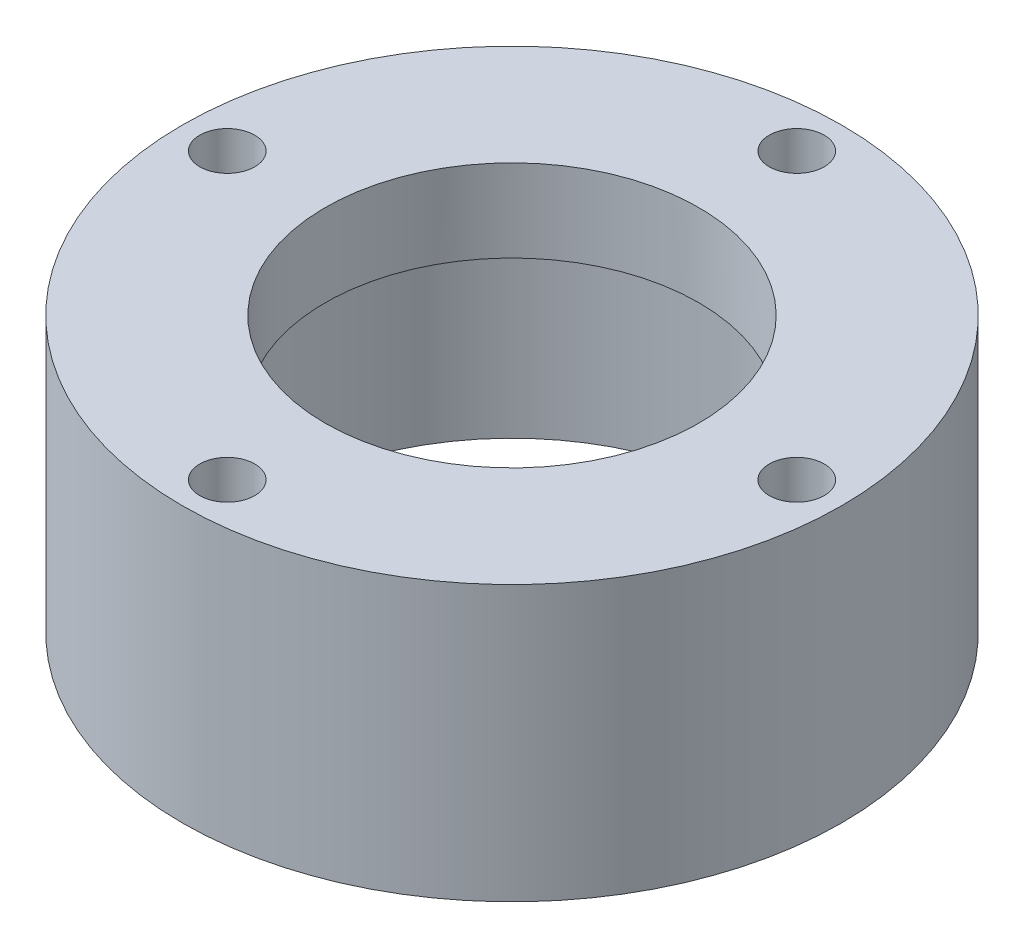
ISO-10303-21;
HEADER;
FILE_DESCRIPTION(('STEP AP214'),'2;1');
FILE_NAME('part.step','',(''),(''),'','','');
FILE_SCHEMA(('AUTOMOTIVE_DESIGN { 1 0 10303 214 1 1 1 1 }'));
ENDSEC;
DATA;
#1=APPLICATION_CONTEXT('core data for automotive mechanical design processes');
#2=APPLICATION_PROTOCOL_DEFINITION('international standard','automotive_design',2000,#1);
#3=PRODUCT_CONTEXT('',#1,'mechanical');
#4=PRODUCT('Part','Part','',(#3));
#5=PRODUCT_RELATED_PRODUCT_CATEGORY('part','',(#4));
#6=PRODUCT_DEFINITION_FORMATION('','',#4);
#7=PRODUCT_DEFINITION_CONTEXT('part definition',#1,'design');
#8=PRODUCT_DEFINITION('design','',#6,#7);
#9=PRODUCT_DEFINITION_SHAPE('','',#8);
#10=(LENGTH_UNIT() NAMED_UNIT(*) SI_UNIT(.MILLI.,.METRE.));
#11=(NAMED_UNIT(*) PLANE_ANGLE_UNIT() SI_UNIT($,.RADIAN.));
#12=(NAMED_UNIT(*) SI_UNIT($,.STERADIAN.) SOLID_ANGLE_UNIT());
#13=UNCERTAINTY_MEASURE_WITH_UNIT(LENGTH_MEASURE(1.E-05),#10,'distance_accuracy_value','');
#14=(GEOMETRIC_REPRESENTATION_CONTEXT(3) GLOBAL_UNCERTAINTY_ASSIGNED_CONTEXT((#13)) GLOBAL_UNIT_ASSIGNED_CONTEXT((#10,
#11,#12)) REPRESENTATION_CONTEXT('',''));
#15=CARTESIAN_POINT('',(0.,0.,0.));
#16=DIRECTION('',(0.,0.,1.));
#17=DIRECTION('',(1.,0.,0.));
#18=AXIS2_PLACEMENT_3D('',#15,#16,#17);
#19=CARTESIAN_POINT('',(0.,13.,1.75400207095439));
#20=DIRECTION('',(0.,-1.,0.));
#21=DIRECTION('',(0.,0.,-1.));
#22=AXIS2_PLACEMENT_3D('',#19,#20,#21);
#23=CYLINDRICAL_SURFACE('',#22,18.);
#24=CARTESIAN_POINT('',(0.,13.,1.75400207095439));
#25=DIRECTION('',(0.,1.,0.));
#26=DIRECTION('',(0.,0.,1.));
#27=AXIS2_PLACEMENT_3D('',#24,#25,#26);
#28=CIRCLE('',#27,18.);
#29=CARTESIAN_POINT('',(0.,13.,19.7540020709544));
#30=VERTEX_POINT('',#29);
#31=EDGE_CURVE('E10',#30,#30,#28,.T.);
#32=ORIENTED_EDGE('',*,*,#31,.F.);
#33=EDGE_LOOP('',(#32));
#34=FACE_BOUND('',#33,.T.);
#35=CARTESIAN_POINT('',(0.,-2.,1.75400207095439));
#36=DIRECTION('',(0.,1.,0.));
#37=DIRECTION('',(0.,0.,1.));
#38=AXIS2_PLACEMENT_3D('',#35,#36,#37);
#39=CIRCLE('',#38,18.);
#40=CARTESIAN_POINT('',(0.,-2.,19.7540020709544));
#41=VERTEX_POINT('',#40);
#42=EDGE_CURVE('E36',#41,#41,#39,.T.);
#43=ORIENTED_EDGE('',*,*,#42,.T.);
#44=EDGE_LOOP('',(#43));
#45=FACE_BOUND('',#44,.T.);
#46=ADVANCED_FACE('F29',(#34,#45),#23,.T.);
#47=CARTESIAN_POINT('',(0.,13.,1.75400207095439));
#48=DIRECTION('',(0.,1.,0.));
#49=DIRECTION('',(0.,0.,1.));
#50=AXIS2_PLACEMENT_3D('',#47,#48,#49);
#51=PLANE('',#50);
#52=CARTESIAN_POINT('',(-15.5458589026705,13.,1.75400207095438));
#53=DIRECTION('',(0.,1.,0.));
#54=DIRECTION('',(0.,0.,1.));
#55=AXIS2_PLACEMENT_3D('',#52,#53,#54);
#56=CIRCLE('',#55,1.5);
#57=CARTESIAN_POINT('',(-15.5458589026705,13.,3.25400207095439));
#58=VERTEX_POINT('',#57);
#59=EDGE_CURVE('E70',#58,#58,#56,.T.);
#60=ORIENTED_EDGE('',*,*,#59,.F.);
#61=EDGE_LOOP('',(#60));
#62=FACE_BOUND('',#61,.T.);
#63=CARTESIAN_POINT('',(0.,13.,17.2998609736249));
#64=DIRECTION('',(0.,1.,0.));
#65=DIRECTION('',(0.,0.,1.));
#66=AXIS2_PLACEMENT_3D('',#63,#64,#65);
#67=CIRCLE('',#66,1.5);
#68=CARTESIAN_POINT('',(0.,13.,18.7998609736249));
#69=VERTEX_POINT('',#68);
#70=EDGE_CURVE('E64',#69,#69,#67,.T.);
#71=ORIENTED_EDGE('',*,*,#70,.F.);
#72=EDGE_LOOP('',(#71));
#73=FACE_BOUND('',#72,.T.);
#74=CARTESIAN_POINT('',(15.5458589026705,13.,1.75400207095438));
#75=DIRECTION('',(0.,1.,0.));
#76=DIRECTION('',(0.,0.,1.));
#77=AXIS2_PLACEMENT_3D('',#74,#75,#76);
#78=CIRCLE('',#77,1.5);
#79=CARTESIAN_POINT('',(15.5458589026705,13.,3.25400207095439));
#80=VERTEX_POINT('',#79);
#81=EDGE_CURVE('E58',#80,#80,#78,.T.);
#82=ORIENTED_EDGE('',*,*,#81,.F.);
#83=EDGE_LOOP('',(#82));
#84=FACE_BOUND('',#83,.T.);
#85=CARTESIAN_POINT('',(0.,13.,-13.7918568317161));
#86=DIRECTION('',(0.,1.,0.));
#87=DIRECTION('',(0.,0.,1.));
#88=AXIS2_PLACEMENT_3D('',#85,#86,#87);
#89=CIRCLE('',#88,1.5);
#90=CARTESIAN_POINT('',(0.,13.,-12.2918568317161));
#91=VERTEX_POINT('',#90);
#92=EDGE_CURVE('E52',#91,#91,#89,.T.);
#93=ORIENTED_EDGE('',*,*,#92,.F.);
#94=EDGE_LOOP('',(#93));
#95=FACE_BOUND('',#94,.T.);
#96=CARTESIAN_POINT('',(3.80921266751599E-08,13.,1.75400198054687));
#97=DIRECTION('',(0.,1.,0.));
#98=DIRECTION('',(0.,0.,1.));
#99=AXIS2_PLACEMENT_3D('',#96,#97,#98);
#100=CIRCLE('',#99,10.2000000049055);
#101=CARTESIAN_POINT('',(3.80921266751599E-08,13.,11.9540019854523));
#102=VERTEX_POINT('',#101);
#103=EDGE_CURVE('E48',#102,#102,#100,.T.);
#104=ORIENTED_EDGE('',*,*,#103,.F.);
#105=EDGE_LOOP('',(#104));
#106=FACE_BOUND('',#105,.T.);
#107=ORIENTED_EDGE('',*,*,#31,.T.);
#108=EDGE_LOOP('',(#107));
#109=FACE_BOUND('',#108,.T.);
#110=ADVANCED_FACE('F86',(#62,#73,#84,#95,#106,#109),#51,.T.);
#111=CARTESIAN_POINT('',(0.,-2.,1.75400207095439));
#112=DIRECTION('',(0.,1.,0.));
#113=DIRECTION('',(0.,0.,1.));
#114=AXIS2_PLACEMENT_3D('',#111,#112,#113);
#115=PLANE('',#114);
#116=CARTESIAN_POINT('',(-15.5458589026705,-2.,1.75400207095438));
#117=DIRECTION('',(0.,1.,0.));
#118=DIRECTION('',(0.,0.,1.));
#119=AXIS2_PLACEMENT_3D('',#116,#117,#118);
#120=CIRCLE('',#119,1.5);
#121=CARTESIAN_POINT('',(-15.5458589026705,-2.,3.25400207095439));
#122=VERTEX_POINT('',#121);
#123=EDGE_CURVE('E67',#122,#122,#120,.T.);
#124=ORIENTED_EDGE('',*,*,#123,.T.);
#125=EDGE_LOOP('',(#124));
#126=FACE_BOUND('',#125,.T.);
#127=CARTESIAN_POINT('',(0.,-2.,17.2998609736249));
#128=DIRECTION('',(0.,1.,0.));
#129=DIRECTION('',(0.,0.,1.));
#130=AXIS2_PLACEMENT_3D('',#127,#128,#129);
#131=CIRCLE('',#130,1.5);
#132=CARTESIAN_POINT('',(0.,-2.,18.7998609736249));
#133=VERTEX_POINT('',#132);
#134=EDGE_CURVE('E61',#133,#133,#131,.T.);
#135=ORIENTED_EDGE('',*,*,#134,.T.);
#136=EDGE_LOOP('',(#135));
#137=FACE_BOUND('',#136,.T.);
#138=CARTESIAN_POINT('',(15.5458589026705,-2.,1.75400207095438));
#139=DIRECTION('',(0.,1.,0.));
#140=DIRECTION('',(0.,0.,1.));
#141=AXIS2_PLACEMENT_3D('',#138,#139,#140);
#142=CIRCLE('',#141,1.5);
#143=CARTESIAN_POINT('',(15.5458589026705,-2.,3.25400207095439));
#144=VERTEX_POINT('',#143);
#145=EDGE_CURVE('E55',#144,#144,#142,.T.);
#146=ORIENTED_EDGE('',*,*,#145,.T.);
#147=EDGE_LOOP('',(#146));
#148=FACE_BOUND('',#147,.T.);
#149=CARTESIAN_POINT('',(0.,-2.,-13.7918568317161));
#150=DIRECTION('',(0.,1.,0.));
#151=DIRECTION('',(0.,0.,1.));
#152=AXIS2_PLACEMENT_3D('',#149,#150,#151);
#153=CIRCLE('',#152,1.5);
#154=CARTESIAN_POINT('',(0.,-2.,-12.2918568317161));
#155=VERTEX_POINT('',#154);
#156=EDGE_CURVE('E51',#155,#155,#153,.T.);
#157=ORIENTED_EDGE('',*,*,#156,.T.);
#158=EDGE_LOOP('',(#157));
#159=FACE_BOUND('',#158,.T.);
#160=CARTESIAN_POINT('',(3.80744880068562E-08,-2.,1.75400198057407));
#161=DIRECTION('',(0.,-1.,0.));
#162=DIRECTION('',(0.,0.,-1.));
#163=AXIS2_PLACEMENT_3D('',#160,#161,#162);
#164=CIRCLE('',#163,13.0000000009261);
#165=CARTESIAN_POINT('',(3.80744880068562E-08,-2.,-11.245998020352));
#166=VERTEX_POINT('',#165);
#167=EDGE_CURVE('E43',#166,#166,#164,.T.);
#168=ORIENTED_EDGE('',*,*,#167,.F.);
#169=EDGE_LOOP('',(#168));
#170=FACE_BOUND('',#169,.T.);
#171=ORIENTED_EDGE('',*,*,#42,.F.);
#172=EDGE_LOOP('',(#171));
#173=FACE_BOUND('',#172,.T.);
#174=ADVANCED_FACE('F76',(#126,#137,#148,#159,#170,#173),#115,.F.);
#175=CARTESIAN_POINT('',(3.80744880068562E-08,8.5,1.75400198057407));
#176=DIRECTION('',(0.,-1.,0.));
#177=DIRECTION('',(0.,0.,-1.));
#178=AXIS2_PLACEMENT_3D('',#175,#176,#177);
#179=CYLINDRICAL_SURFACE('',#178,13.0000000009261);
#180=CARTESIAN_POINT('',(3.80744880068562E-08,8.5,1.75400198057407));
#181=DIRECTION('',(0.,-1.,0.));
#182=DIRECTION('',(0.,0.,-1.));
#183=AXIS2_PLACEMENT_3D('',#180,#181,#182);
#184=CIRCLE('',#183,13.0000000009261);
#185=CARTESIAN_POINT('',(3.80744880068562E-08,8.5,-11.245998020352));
#186=VERTEX_POINT('',#185);
#187=EDGE_CURVE('E41',#186,#186,#184,.T.);
#188=CARTESIAN_POINT('',(3.80744880068562E-08,8.5,-11.245998020352));
#189=CARTESIAN_POINT('',(3.80744880068562E-08,8.390625,-11.245998020352));
#190=CARTESIAN_POINT('',(3.80744880068562E-08,8.28125,-11.245998020352));
#191=CARTESIAN_POINT('',(3.80744880068562E-08,8.0625,-11.245998020352));
#192=CARTESIAN_POINT('',(3.80744880068562E-08,7.953125,-11.245998020352));
#193=CARTESIAN_POINT('',(3.80744880068562E-08,7.734375,-11.245998020352));
#194=CARTESIAN_POINT('',(3.80744880068562E-08,7.625,-11.245998020352));
#195=CARTESIAN_POINT('',(3.80744880068562E-08,7.40625,-11.245998020352));
#196=CARTESIAN_POINT('',(3.80744880068562E-08,7.296875,-11.245998020352));
#197=CARTESIAN_POINT('',(3.80744880068562E-08,7.078125,-11.245998020352));
#198=CARTESIAN_POINT('',(3.80744880068562E-08,6.96875,-11.245998020352));
#199=CARTESIAN_POINT('',(3.80744880068562E-08,6.75,-11.245998020352));
#200=CARTESIAN_POINT('',(3.80744880068562E-08,6.640625,-11.245998020352));
#201=CARTESIAN_POINT('',(3.80744880068562E-08,6.421875,-11.245998020352));
#202=CARTESIAN_POINT('',(3.80744880068562E-08,6.3125,-11.245998020352));
#203=CARTESIAN_POINT('',(3.80744880068562E-08,6.09375,-11.245998020352));
#204=CARTESIAN_POINT('',(3.80744880068562E-08,5.984375,-11.245998020352));
#205=CARTESIAN_POINT('',(3.80744880068562E-08,5.765625,-11.245998020352));
#206=CARTESIAN_POINT('',(3.80744880068562E-08,5.65625,-11.245998020352));
#207=CARTESIAN_POINT('',(3.80744880068562E-08,5.4375,-11.245998020352));
#208=CARTESIAN_POINT('',(3.80744880068562E-08,5.328125,-11.245998020352));
#209=CARTESIAN_POINT('',(3.80744880068562E-08,5.109375,-11.245998020352));
#210=CARTESIAN_POINT('',(3.80744880068562E-08,5.,-11.245998020352));
#211=CARTESIAN_POINT('',(3.80744880068562E-08,4.78125,-11.245998020352));
#212=CARTESIAN_POINT('',(3.80744880068562E-08,4.671875,-11.245998020352));
#213=CARTESIAN_POINT('',(3.80744880068562E-08,4.453125,-11.245998020352));
#214=CARTESIAN_POINT('',(3.80744880068562E-08,4.34375,-11.245998020352));
#215=CARTESIAN_POINT('',(3.80744880068562E-08,4.125,-11.245998020352));
#216=CARTESIAN_POINT('',(3.80744880068562E-08,4.015625,-11.245998020352));
#217=CARTESIAN_POINT('',(3.80744880068562E-08,3.796875,-11.245998020352));
#218=CARTESIAN_POINT('',(3.80744880068562E-08,3.6875,-11.245998020352));
#219=CARTESIAN_POINT('',(3.80744880068562E-08,3.46875,-11.245998020352));
#220=CARTESIAN_POINT('',(3.80744880068562E-08,3.359375,-11.245998020352));
#221=CARTESIAN_POINT('',(3.80744880068562E-08,3.140625,-11.245998020352));
#222=CARTESIAN_POINT('',(3.80744880068562E-08,3.03125,-11.245998020352));
#223=CARTESIAN_POINT('',(3.80744880068562E-08,2.8125,-11.245998020352));
#224=CARTESIAN_POINT('',(3.80744880068562E-08,2.703125,-11.245998020352));
#225=CARTESIAN_POINT('',(3.80744880068562E-08,2.484375,-11.245998020352));
#226=CARTESIAN_POINT('',(3.80744880068562E-08,2.375,-11.245998020352));
#227=CARTESIAN_POINT('',(3.80744880068562E-08,2.15625,-11.245998020352));
#228=CARTESIAN_POINT('',(3.80744880068562E-08,2.046875,-11.245998020352));
#229=CARTESIAN_POINT('',(3.80744880068562E-08,1.828125,-11.245998020352));
#230=CARTESIAN_POINT('',(3.80744880068562E-08,1.71875,-11.245998020352));
#231=CARTESIAN_POINT('',(3.80744880068562E-08,1.5,-11.245998020352));
#232=CARTESIAN_POINT('',(3.80744880068562E-08,1.390625,-11.245998020352));
#233=CARTESIAN_POINT('',(3.80744880068562E-08,1.171875,-11.245998020352));
#234=CARTESIAN_POINT('',(3.80744880068562E-08,1.0625,-11.245998020352));
#235=CARTESIAN_POINT('',(3.80744880068562E-08,0.84375,-11.245998020352));
#236=CARTESIAN_POINT('',(3.80744880068562E-08,0.734375,-11.245998020352));
#237=CARTESIAN_POINT('',(3.80744880068562E-08,0.515625,-11.245998020352));
#238=CARTESIAN_POINT('',(3.80744880068562E-08,0.40625,-11.245998020352));
#239=CARTESIAN_POINT('',(3.80744880068562E-08,0.1875,-11.245998020352));
#240=CARTESIAN_POINT('',(3.80744880068562E-08,0.0781250000000001,-11.245998020352));
#241=CARTESIAN_POINT('',(3.80744880068562E-08,-0.140625,-11.245998020352));
#242=CARTESIAN_POINT('',(3.80744880068562E-08,-0.249999999999999,-11.245998020352));
#243=CARTESIAN_POINT('',(3.80744880068562E-08,-0.468749999999999,-11.245998020352));
#244=CARTESIAN_POINT('',(3.80744880068562E-08,-0.578124999999999,-11.245998020352));
#245=CARTESIAN_POINT('',(3.80744880068562E-08,-0.796874999999999,-11.245998020352));
#246=CARTESIAN_POINT('',(3.80744880068562E-08,-0.906249999999999,-11.245998020352));
#247=CARTESIAN_POINT('',(3.80744880068562E-08,-1.125,-11.245998020352));
#248=CARTESIAN_POINT('',(3.80744880068562E-08,-1.234375,-11.245998020352));
#249=CARTESIAN_POINT('',(3.80744880068562E-08,-1.453125,-11.245998020352));
#250=CARTESIAN_POINT('',(3.80744880068562E-08,-1.5625,-11.245998020352));
#251=CARTESIAN_POINT('',(3.80744880068562E-08,-1.78125,-11.245998020352));
#252=CARTESIAN_POINT('',(3.80744880068562E-08,-1.890625,-11.245998020352));
#253=CARTESIAN_POINT('',(3.80744880068562E-08,-2.,-11.245998020352));
#254=B_SPLINE_CURVE_WITH_KNOTS('',3,(#188,#189,#190,#191,#192,#193,#194,#195,#196,#197,#198,
#199,#200,#201,#202,#203,#204,#205,#206,#207,#208,#209,#210,#211,#212,#213,#214,#215,#216,#217,
#218,#219,#220,#221,#222,#223,#224,#225,#226,#227,#228,#229,#230,#231,#232,#233,#234,#235,#236,
#237,#238,#239,#240,#241,#242,#243,#244,#245,#246,#247,#248,#249,#250,#251,#252,#253),
.UNSPECIFIED.,.F.,.F.,(4,2,2,2,2,2,2,2,2,2,2,2,2,2,2,2,2,2,2,2,2,2,2,2,2,2,2,2,2,2,2,2,4),(0.,
0.328125,0.656250000000001,0.984375000000001,1.3125,1.640625,1.96875,2.296875,2.625,2.953125,
3.28125,3.609375,3.9375,4.265625,4.59375,4.921875,5.25,5.578125,5.90625,6.234375,6.5625,
6.890625,7.21875,7.546875,7.875,8.203125,8.53125,8.859375,9.1875,9.515625,9.84375,10.171875,
10.5),.UNSPECIFIED.);
#255=EDGE_CURVE('BSEAM111',#186,#166,#254,.T.);
#256=ORIENTED_EDGE('',*,*,#187,.F.);
#257=ORIENTED_EDGE('',*,*,#167,.T.);
#258=ORIENTED_EDGE('',*,*,#255,.T.);
#259=ORIENTED_EDGE('',*,*,#255,.F.);
#260=EDGE_LOOP('',(#256,#258,#257,#259));
#261=FACE_BOUND('',#260,.T.);
#262=ADVANCED_FACE('F111',(#261),#179,.F.);
#263=CARTESIAN_POINT('',(3.80744880068562E-08,8.5,1.75400198057407));
#264=DIRECTION('',(0.,-1.,0.));
#265=DIRECTION('',(0.,0.,-1.));
#266=AXIS2_PLACEMENT_3D('',#263,#264,#265);
#267=PLANE('',#266);
#268=CARTESIAN_POINT('',(3.80921266751599E-08,8.5,1.75400198054687));
#269=DIRECTION('',(0.,-1.,0.));
#270=DIRECTION('',(0.,0.,-1.));
#271=AXIS2_PLACEMENT_3D('',#268,#269,#270);
#272=CIRCLE('',#271,10.2000000049055);
#273=CARTESIAN_POINT('',(3.80921266751599E-08,8.5,-8.44599802435859));
#274=VERTEX_POINT('',#273);
#275=EDGE_CURVE('E32',#274,#274,#272,.T.);
#276=ORIENTED_EDGE('',*,*,#275,.F.);
#277=EDGE_LOOP('',(#276));
#278=FACE_BOUND('',#277,.T.);
#279=ORIENTED_EDGE('',*,*,#187,.T.);
#280=EDGE_LOOP('',(#279));
#281=FACE_BOUND('',#280,.T.);
#282=ADVANCED_FACE('F101',(#278,#281),#267,.T.);
#283=CARTESIAN_POINT('',(3.80921266751599E-08,-2.,1.75400198054687));
#284=DIRECTION('',(0.,1.,0.));
#285=DIRECTION('',(0.,0.,1.));
#286=AXIS2_PLACEMENT_3D('',#283,#284,#285);
#287=CYLINDRICAL_SURFACE('',#286,10.2000000049055);
#288=ORIENTED_EDGE('',*,*,#275,.T.);
#289=EDGE_LOOP('',(#288));
#290=FACE_BOUND('',#289,.T.);
#291=ORIENTED_EDGE('',*,*,#103,.T.);
#292=EDGE_LOOP('',(#291));
#293=FACE_BOUND('',#292,.T.);
#294=ADVANCED_FACE('F98',(#290,#293),#287,.F.);
#295=CARTESIAN_POINT('',(0.,-2.,-13.7918568317161));
#296=DIRECTION('',(0.,1.,0.));
#297=DIRECTION('',(0.,0.,1.));
#298=AXIS2_PLACEMENT_3D('',#295,#296,#297);
#299=CYLINDRICAL_SURFACE('',#298,1.5);
#300=ORIENTED_EDGE('',*,*,#156,.F.);
#301=EDGE_LOOP('',(#300));
#302=FACE_BOUND('',#301,.T.);
#303=ORIENTED_EDGE('',*,*,#92,.T.);
#304=EDGE_LOOP('',(#303));
#305=FACE_BOUND('',#304,.T.);
#306=ADVANCED_FACE('F100',(#302,#305),#299,.F.);
#307=CARTESIAN_POINT('',(15.5458589026705,-2.,1.75400207095438));
#308=DIRECTION('',(0.,1.,0.));
#309=DIRECTION('',(0.,0.,1.));
#310=AXIS2_PLACEMENT_3D('',#307,#308,#309);
#311=CYLINDRICAL_SURFACE('',#310,1.5);
#312=ORIENTED_EDGE('',*,*,#145,.F.);
#313=EDGE_LOOP('',(#312));
#314=FACE_BOUND('',#313,.T.);
#315=ORIENTED_EDGE('',*,*,#81,.T.);
#316=EDGE_LOOP('',(#315));
#317=FACE_BOUND('',#316,.T.);
#318=ADVANCED_FACE('F108',(#314,#317),#311,.F.);
#319=CARTESIAN_POINT('',(0.,-2.,17.2998609736249));
#320=DIRECTION('',(0.,1.,0.));
#321=DIRECTION('',(0.,0.,1.));
#322=AXIS2_PLACEMENT_3D('',#319,#320,#321);
#323=CYLINDRICAL_SURFACE('',#322,1.5);
#324=ORIENTED_EDGE('',*,*,#134,.F.);
#325=EDGE_LOOP('',(#324));
#326=FACE_BOUND('',#325,.T.);
#327=ORIENTED_EDGE('',*,*,#70,.T.);
#328=EDGE_LOOP('',(#327));
#329=FACE_BOUND('',#328,.T.);
#330=ADVANCED_FACE('F82',(#326,#329),#323,.F.);
#331=CARTESIAN_POINT('',(-15.5458589026705,-2.,1.75400207095438));
#332=DIRECTION('',(0.,1.,0.));
#333=DIRECTION('',(0.,0.,1.));
#334=AXIS2_PLACEMENT_3D('',#331,#332,#333);
#335=CYLINDRICAL_SURFACE('',#334,1.5);
#336=ORIENTED_EDGE('',*,*,#123,.F.);
#337=EDGE_LOOP('',(#336));
#338=FACE_BOUND('',#337,.T.);
#339=ORIENTED_EDGE('',*,*,#59,.T.);
#340=EDGE_LOOP('',(#339));
#341=FACE_BOUND('',#340,.T.);
#342=ADVANCED_FACE('F79',(#338,#341),#335,.F.);
#343=CLOSED_SHELL('',(#46,#110,#174,#262,#282,#294,#306,#318,#330,#342));
#344=MANIFOLD_SOLID_BREP('B2',#343);
#345=ADVANCED_BREP_SHAPE_REPRESENTATION('',(#18,#344),#14);
#346=SHAPE_DEFINITION_REPRESENTATION(#9,#345);
ENDSEC;
END-ISO-10303-21;
